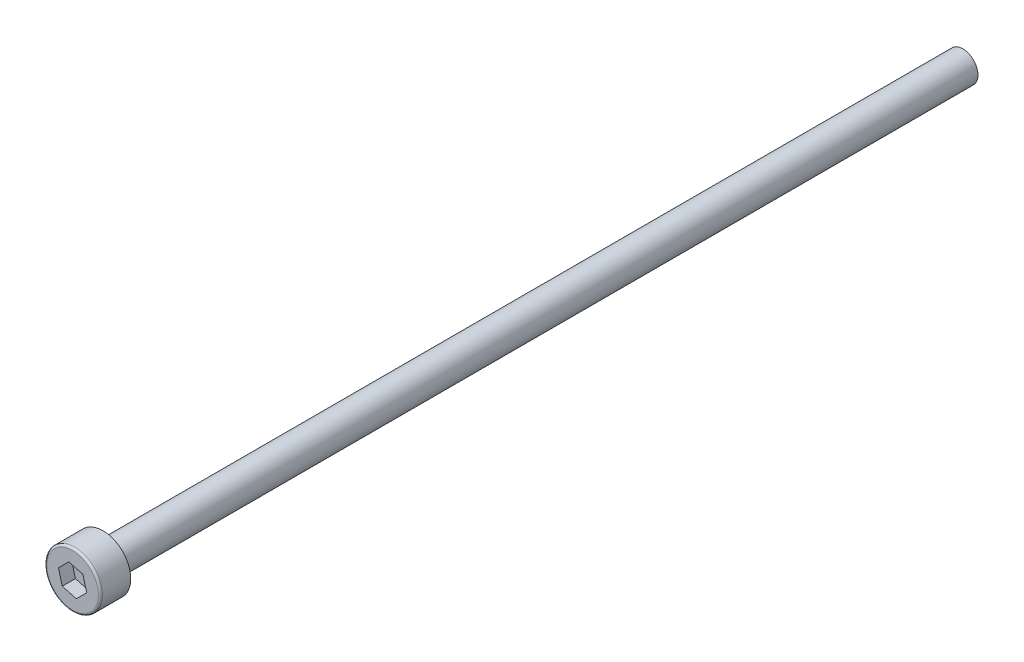
ISO-10303-21;
HEADER;
FILE_DESCRIPTION(('STEP AP214'),'2;1');
FILE_NAME('part.step','',(''),(''),'','','');
FILE_SCHEMA(('AUTOMOTIVE_DESIGN { 1 0 10303 214 1 1 1 1 }'));
ENDSEC;
DATA;
#1=APPLICATION_CONTEXT('core data for automotive mechanical design processes');
#2=APPLICATION_PROTOCOL_DEFINITION('international standard','automotive_design',2000,#1);
#3=PRODUCT_CONTEXT('',#1,'mechanical');
#4=PRODUCT('Part','Part','',(#3));
#5=PRODUCT_RELATED_PRODUCT_CATEGORY('part','',(#4));
#6=PRODUCT_DEFINITION_FORMATION('','',#4);
#7=PRODUCT_DEFINITION_CONTEXT('part definition',#1,'design');
#8=PRODUCT_DEFINITION('design','',#6,#7);
#9=PRODUCT_DEFINITION_SHAPE('','',#8);
#10=(LENGTH_UNIT() NAMED_UNIT(*) SI_UNIT(.MILLI.,.METRE.));
#11=(NAMED_UNIT(*) PLANE_ANGLE_UNIT() SI_UNIT($,.RADIAN.));
#12=(NAMED_UNIT(*) SI_UNIT($,.STERADIAN.) SOLID_ANGLE_UNIT());
#13=UNCERTAINTY_MEASURE_WITH_UNIT(LENGTH_MEASURE(1.E-05),#10,'distance_accuracy_value','');
#14=(GEOMETRIC_REPRESENTATION_CONTEXT(3) GLOBAL_UNCERTAINTY_ASSIGNED_CONTEXT((#13)) GLOBAL_UNIT_ASSIGNED_CONTEXT((#10,
#11,#12)) REPRESENTATION_CONTEXT('',''));
#15=CARTESIAN_POINT('',(0.,0.,0.));
#16=DIRECTION('',(0.,0.,1.));
#17=DIRECTION('',(1.,0.,0.));
#18=AXIS2_PLACEMENT_3D('',#15,#16,#17);
#19=CARTESIAN_POINT('',(0.,0.,0.));
#20=DIRECTION('',(0.,0.,1.));
#21=DIRECTION('',(1.,0.,0.));
#22=AXIS2_PLACEMENT_3D('',#19,#20,#21);
#23=PLANE('',#22);
#24=CARTESIAN_POINT('',(0.,0.,0.));
#25=DIRECTION('',(0.,0.,1.));
#26=DIRECTION('',(1.,0.,0.));
#27=AXIS2_PLACEMENT_3D('',#24,#25,#26);
#28=CIRCLE('',#27,2.75);
#29=CARTESIAN_POINT('',(2.75,0.,0.));
#30=VERTEX_POINT('',#29);
#31=EDGE_CURVE('E136',#30,#30,#28,.T.);
#32=ORIENTED_EDGE('',*,*,#31,.F.);
#33=EDGE_LOOP('',(#32));
#34=FACE_BOUND('',#33,.T.);
#35=CARTESIAN_POINT('',(0.,0.,0.));
#36=DIRECTION('',(0.,0.,1.));
#37=DIRECTION('',(1.,0.,0.));
#38=AXIS2_PLACEMENT_3D('',#35,#36,#37);
#39=CIRCLE('',#38,1.5);
#40=CARTESIAN_POINT('',(1.5,0.,0.));
#41=VERTEX_POINT('',#40);
#42=EDGE_CURVE('E144',#41,#41,#39,.F.);
#43=ORIENTED_EDGE('',*,*,#42,.F.);
#44=EDGE_LOOP('',(#43));
#45=FACE_BOUND('',#44,.T.);
#46=ADVANCED_FACE('F33',(#34,#45),#23,.F.);
#47=CARTESIAN_POINT('',(0.,0.,3.));
#48=DIRECTION('',(0.,0.,-1.));
#49=DIRECTION('',(-1.,0.,0.));
#50=AXIS2_PLACEMENT_3D('',#47,#48,#49);
#51=CYLINDRICAL_SURFACE('',#50,2.75);
#52=CARTESIAN_POINT('',(0.,0.,2.8));
#53=DIRECTION('',(0.,0.,1.));
#54=DIRECTION('',(1.,0.,0.));
#55=AXIS2_PLACEMENT_3D('',#52,#53,#54);
#56=CIRCLE('',#55,2.75);
#57=CARTESIAN_POINT('',(2.75,0.,2.8));
#58=VERTEX_POINT('',#57);
#59=EDGE_CURVE('E11',#58,#58,#56,.F.);
#60=ORIENTED_EDGE('',*,*,#59,.T.);
#61=EDGE_LOOP('',(#60));
#62=FACE_BOUND('',#61,.T.);
#63=ORIENTED_EDGE('',*,*,#31,.T.);
#64=EDGE_LOOP('',(#63));
#65=FACE_BOUND('',#64,.T.);
#66=ADVANCED_FACE('F163',(#62,#65),#51,.T.);
#67=CARTESIAN_POINT('',(0.,0.,3.));
#68=DIRECTION('',(0.,0.,1.));
#69=DIRECTION('',(1.,0.,0.));
#70=AXIS2_PLACEMENT_3D('',#67,#68,#69);
#71=PLANE('',#70);
#72=CARTESIAN_POINT('',(0.,0.,3.));
#73=DIRECTION('',(0.,0.,1.));
#74=DIRECTION('',(1.,0.,0.));
#75=AXIS2_PLACEMENT_3D('',#72,#73,#74);
#76=CIRCLE('',#75,2.55);
#77=CARTESIAN_POINT('',(2.55,0.,3.));
#78=VERTEX_POINT('',#77);
#79=EDGE_CURVE('E41',#78,#78,#76,.T.);
#80=ORIENTED_EDGE('',*,*,#79,.T.);
#81=EDGE_LOOP('',(#80));
#82=FACE_BOUND('',#81,.T.);
#83=DIRECTION('',(0.258819045102521,-0.965925826289068,0.));
#84=VECTOR('',#83,1.);
#85=CARTESIAN_POINT('',(-1.39419383956301,0.373573113403356,3.));
#86=LINE('',#85,#84);
#87=CARTESIAN_POINT('',(-1.39419383956301,0.373573113403356,3.));
#88=VERTEX_POINT('',#87);
#89=CARTESIAN_POINT('',(-1.02062072615966,-1.02062072615966,3.));
#90=VERTEX_POINT('',#89);
#91=EDGE_CURVE('E48',#88,#90,#86,.T.);
#92=ORIENTED_EDGE('',*,*,#91,.F.);
#93=DIRECTION('',(-0.707106781186548,-0.707106781186548,0.));
#94=VECTOR('',#93,1.);
#95=CARTESIAN_POINT('',(-0.373573113403355,1.39419383956301,3.));
#96=LINE('',#95,#94);
#97=CARTESIAN_POINT('',(-0.373573113403355,1.39419383956301,3.));
#98=VERTEX_POINT('',#97);
#99=EDGE_CURVE('E132',#98,#88,#96,.T.);
#100=ORIENTED_EDGE('',*,*,#99,.F.);
#101=DIRECTION('',(-0.965925826289068,0.258819045102521,0.));
#102=VECTOR('',#101,1.);
#103=CARTESIAN_POINT('',(1.02062072615966,1.02062072615966,3.));
#104=LINE('',#103,#102);
#105=CARTESIAN_POINT('',(1.02062072615966,1.02062072615966,3.));
#106=VERTEX_POINT('',#105);
#107=EDGE_CURVE('E130',#106,#98,#104,.T.);
#108=ORIENTED_EDGE('',*,*,#107,.F.);
#109=DIRECTION('',(-0.258819045102521,0.965925826289068,0.));
#110=VECTOR('',#109,1.);
#111=CARTESIAN_POINT('',(1.39419383956301,-0.373573113403355,3.));
#112=LINE('',#111,#110);
#113=CARTESIAN_POINT('',(1.39419383956301,-0.373573113403355,3.));
#114=VERTEX_POINT('',#113);
#115=EDGE_CURVE('E96',#114,#106,#112,.T.);
#116=ORIENTED_EDGE('',*,*,#115,.F.);
#117=DIRECTION('',(0.707106781186548,0.707106781186548,0.));
#118=VECTOR('',#117,1.);
#119=CARTESIAN_POINT('',(0.373573113403355,-1.39419383956301,3.));
#120=LINE('',#119,#118);
#121=CARTESIAN_POINT('',(0.373573113403355,-1.39419383956301,3.));
#122=VERTEX_POINT('',#121);
#123=EDGE_CURVE('E126',#122,#114,#120,.T.);
#124=ORIENTED_EDGE('',*,*,#123,.F.);
#125=DIRECTION('',(0.965925826289068,-0.258819045102521,0.));
#126=VECTOR('',#125,1.);
#127=CARTESIAN_POINT('',(-1.02062072615966,-1.02062072615966,3.));
#128=LINE('',#127,#126);
#129=EDGE_CURVE('E122',#90,#122,#128,.T.);
#130=ORIENTED_EDGE('',*,*,#129,.F.);
#131=EDGE_LOOP('',(#92,#100,#108,#116,#124,#130));
#132=FACE_BOUND('',#131,.T.);
#133=ADVANCED_FACE('F149',(#82,#132),#71,.T.);
#134=CARTESIAN_POINT('',(-1.39419383956301,0.373573113403356,1.7));
#135=DIRECTION('',(-0.965925826289068,-0.258819045102521,0.));
#136=DIRECTION('',(0.258819045102521,-0.965925826289068,0.));
#137=AXIS2_PLACEMENT_3D('',#134,#135,#136);
#138=PLANE('',#137);
#139=ORIENTED_EDGE('',*,*,#91,.T.);
#140=DIRECTION('',(0.,0.,1.));
#141=VECTOR('',#140,1.);
#142=CARTESIAN_POINT('',(-1.02062072615966,-1.02062072615966,1.7));
#143=LINE('',#142,#141);
#144=CARTESIAN_POINT('',(-1.02062072615966,-1.02062072615966,1.7));
#145=VERTEX_POINT('',#144);
#146=EDGE_CURVE('E78',#145,#90,#143,.T.);
#147=ORIENTED_EDGE('',*,*,#146,.F.);
#148=DIRECTION('',(0.258819045102521,-0.965925826289068,0.));
#149=VECTOR('',#148,1.);
#150=CARTESIAN_POINT('',(-1.39419383956301,0.373573113403356,1.7));
#151=LINE('',#150,#149);
#152=CARTESIAN_POINT('',(-1.39419383956301,0.373573113403356,1.7));
#153=VERTEX_POINT('',#152);
#154=EDGE_CURVE('E134',#153,#145,#151,.T.);
#155=ORIENTED_EDGE('',*,*,#154,.F.);
#156=DIRECTION('',(0.,0.,1.));
#157=VECTOR('',#156,1.);
#158=CARTESIAN_POINT('',(-1.39419383956301,0.373573113403356,1.7));
#159=LINE('',#158,#157);
#160=EDGE_CURVE('E56',#153,#88,#159,.T.);
#161=ORIENTED_EDGE('',*,*,#160,.T.);
#162=EDGE_LOOP('',(#139,#147,#155,#161));
#163=FACE_BOUND('',#162,.T.);
#164=ADVANCED_FACE('F175',(#163),#138,.F.);
#165=CARTESIAN_POINT('',(-0.373573113403355,1.39419383956301,1.7));
#166=DIRECTION('',(-0.707106781186548,0.707106781186548,0.));
#167=DIRECTION('',(-0.707106781186548,-0.707106781186548,0.));
#168=AXIS2_PLACEMENT_3D('',#165,#166,#167);
#169=PLANE('',#168);
#170=ORIENTED_EDGE('',*,*,#99,.T.);
#171=ORIENTED_EDGE('',*,*,#160,.F.);
#172=DIRECTION('',(-0.707106781186548,-0.707106781186548,0.));
#173=VECTOR('',#172,1.);
#174=CARTESIAN_POINT('',(-0.373573113403355,1.39419383956301,1.7));
#175=LINE('',#174,#173);
#176=CARTESIAN_POINT('',(-0.373573113403355,1.39419383956301,1.7));
#177=VERTEX_POINT('',#176);
#178=EDGE_CURVE('E108',#177,#153,#175,.T.);
#179=ORIENTED_EDGE('',*,*,#178,.F.);
#180=DIRECTION('',(0.,0.,1.));
#181=VECTOR('',#180,1.);
#182=CARTESIAN_POINT('',(-0.373573113403355,1.39419383956301,1.7));
#183=LINE('',#182,#181);
#184=EDGE_CURVE('E100',#177,#98,#183,.T.);
#185=ORIENTED_EDGE('',*,*,#184,.T.);
#186=EDGE_LOOP('',(#170,#171,#179,#185));
#187=FACE_BOUND('',#186,.T.);
#188=ADVANCED_FACE('F178',(#187),#169,.F.);
#189=CARTESIAN_POINT('',(1.02062072615966,1.02062072615966,1.7));
#190=DIRECTION('',(0.258819045102521,0.965925826289068,0.));
#191=DIRECTION('',(-0.965925826289068,0.258819045102521,0.));
#192=AXIS2_PLACEMENT_3D('',#189,#190,#191);
#193=PLANE('',#192);
#194=ORIENTED_EDGE('',*,*,#107,.T.);
#195=ORIENTED_EDGE('',*,*,#184,.F.);
#196=DIRECTION('',(-0.965925826289068,0.258819045102521,0.));
#197=VECTOR('',#196,1.);
#198=CARTESIAN_POINT('',(1.02062072615966,1.02062072615966,1.7));
#199=LINE('',#198,#197);
#200=CARTESIAN_POINT('',(1.02062072615966,1.02062072615966,1.7));
#201=VERTEX_POINT('',#200);
#202=EDGE_CURVE('E104',#201,#177,#199,.T.);
#203=ORIENTED_EDGE('',*,*,#202,.F.);
#204=DIRECTION('',(0.,0.,1.));
#205=VECTOR('',#204,1.);
#206=CARTESIAN_POINT('',(1.02062072615966,1.02062072615966,1.7));
#207=LINE('',#206,#205);
#208=EDGE_CURVE('E89',#201,#106,#207,.T.);
#209=ORIENTED_EDGE('',*,*,#208,.T.);
#210=EDGE_LOOP('',(#194,#195,#203,#209));
#211=FACE_BOUND('',#210,.T.);
#212=ADVANCED_FACE('F105',(#211),#193,.F.);
#213=CARTESIAN_POINT('',(1.39419383956301,-0.373573113403355,1.7));
#214=DIRECTION('',(0.965925826289068,0.258819045102521,0.));
#215=DIRECTION('',(-0.258819045102521,0.965925826289068,0.));
#216=AXIS2_PLACEMENT_3D('',#213,#214,#215);
#217=PLANE('',#216);
#218=ORIENTED_EDGE('',*,*,#115,.T.);
#219=ORIENTED_EDGE('',*,*,#208,.F.);
#220=DIRECTION('',(-0.258819045102521,0.965925826289068,0.));
#221=VECTOR('',#220,1.);
#222=CARTESIAN_POINT('',(1.39419383956301,-0.373573113403355,1.7));
#223=LINE('',#222,#221);
#224=CARTESIAN_POINT('',(1.39419383956301,-0.373573113403355,1.7));
#225=VERTEX_POINT('',#224);
#226=EDGE_CURVE('E93',#225,#201,#223,.T.);
#227=ORIENTED_EDGE('',*,*,#226,.F.);
#228=DIRECTION('',(0.,0.,1.));
#229=VECTOR('',#228,1.);
#230=CARTESIAN_POINT('',(1.39419383956301,-0.373573113403355,1.7));
#231=LINE('',#230,#229);
#232=EDGE_CURVE('E101',#225,#114,#231,.T.);
#233=ORIENTED_EDGE('',*,*,#232,.T.);
#234=EDGE_LOOP('',(#218,#219,#227,#233));
#235=FACE_BOUND('',#234,.T.);
#236=ADVANCED_FACE('F91',(#235),#217,.F.);
#237=CARTESIAN_POINT('',(0.373573113403355,-1.39419383956301,1.7));
#238=DIRECTION('',(0.707106781186548,-0.707106781186548,0.));
#239=DIRECTION('',(0.707106781186548,0.707106781186548,0.));
#240=AXIS2_PLACEMENT_3D('',#237,#238,#239);
#241=PLANE('',#240);
#242=ORIENTED_EDGE('',*,*,#123,.T.);
#243=ORIENTED_EDGE('',*,*,#232,.F.);
#244=DIRECTION('',(0.707106781186548,0.707106781186548,0.));
#245=VECTOR('',#244,1.);
#246=CARTESIAN_POINT('',(0.373573113403355,-1.39419383956301,1.7));
#247=LINE('',#246,#245);
#248=CARTESIAN_POINT('',(0.373573113403355,-1.39419383956301,1.7));
#249=VERTEX_POINT('',#248);
#250=EDGE_CURVE('E114',#249,#225,#247,.T.);
#251=ORIENTED_EDGE('',*,*,#250,.F.);
#252=DIRECTION('',(0.,0.,1.));
#253=VECTOR('',#252,1.);
#254=CARTESIAN_POINT('',(0.373573113403355,-1.39419383956301,1.7));
#255=LINE('',#254,#253);
#256=EDGE_CURVE('E139',#249,#122,#255,.T.);
#257=ORIENTED_EDGE('',*,*,#256,.T.);
#258=EDGE_LOOP('',(#242,#243,#251,#257));
#259=FACE_BOUND('',#258,.T.);
#260=ADVANCED_FACE('F182',(#259),#241,.F.);
#261=CARTESIAN_POINT('',(-1.02062072615966,-1.02062072615966,1.7));
#262=DIRECTION('',(-0.258819045102521,-0.965925826289068,0.));
#263=DIRECTION('',(0.965925826289068,-0.258819045102521,0.));
#264=AXIS2_PLACEMENT_3D('',#261,#262,#263);
#265=PLANE('',#264);
#266=ORIENTED_EDGE('',*,*,#129,.T.);
#267=ORIENTED_EDGE('',*,*,#256,.F.);
#268=DIRECTION('',(0.965925826289068,-0.258819045102521,0.));
#269=VECTOR('',#268,1.);
#270=CARTESIAN_POINT('',(-1.02062072615966,-1.02062072615966,1.7));
#271=LINE('',#270,#269);
#272=EDGE_CURVE('E116',#145,#249,#271,.T.);
#273=ORIENTED_EDGE('',*,*,#272,.F.);
#274=ORIENTED_EDGE('',*,*,#146,.T.);
#275=EDGE_LOOP('',(#266,#267,#273,#274));
#276=FACE_BOUND('',#275,.T.);
#277=ADVANCED_FACE('F179',(#276),#265,.F.);
#278=CARTESIAN_POINT('',(0.,0.,1.7));
#279=DIRECTION('',(0.,0.,1.));
#280=DIRECTION('',(1.,0.,0.));
#281=AXIS2_PLACEMENT_3D('',#278,#279,#280);
#282=PLANE('',#281);
#283=ORIENTED_EDGE('',*,*,#154,.T.);
#284=ORIENTED_EDGE('',*,*,#272,.T.);
#285=ORIENTED_EDGE('',*,*,#250,.T.);
#286=ORIENTED_EDGE('',*,*,#226,.T.);
#287=ORIENTED_EDGE('',*,*,#202,.T.);
#288=ORIENTED_EDGE('',*,*,#178,.T.);
#289=EDGE_LOOP('',(#283,#284,#285,#286,#287,#288));
#290=FACE_BOUND('',#289,.T.);
#291=ADVANCED_FACE('F111',(#290),#282,.T.);
#292=CARTESIAN_POINT('',(0.,0.,-85.));
#293=DIRECTION('',(0.,0.,1.));
#294=DIRECTION('',(1.,0.,0.));
#295=AXIS2_PLACEMENT_3D('',#292,#293,#294);
#296=CYLINDRICAL_SURFACE('',#295,1.5);
#297=CARTESIAN_POINT('',(0.,0.,-85.));
#298=DIRECTION('',(0.,0.,-1.));
#299=DIRECTION('',(-1.,0.,0.));
#300=AXIS2_PLACEMENT_3D('',#297,#298,#299);
#301=CIRCLE('',#300,1.5);
#302=CARTESIAN_POINT('',(-1.5,0.,-85.));
#303=VERTEX_POINT('',#302);
#304=EDGE_CURVE('E123',#303,#303,#301,.T.);
#305=ORIENTED_EDGE('',*,*,#304,.F.);
#306=EDGE_LOOP('',(#305));
#307=FACE_BOUND('',#306,.T.);
#308=ORIENTED_EDGE('',*,*,#42,.T.);
#309=EDGE_LOOP('',(#308));
#310=FACE_BOUND('',#309,.T.);
#311=ADVANCED_FACE('F158',(#307,#310),#296,.T.);
#312=CARTESIAN_POINT('',(0.,0.,-85.));
#313=DIRECTION('',(0.,0.,-1.));
#314=DIRECTION('',(-1.,0.,0.));
#315=AXIS2_PLACEMENT_3D('',#312,#313,#314);
#316=PLANE('',#315);
#317=ORIENTED_EDGE('',*,*,#304,.T.);
#318=EDGE_LOOP('',(#317));
#319=FACE_BOUND('',#318,.T.);
#320=ADVANCED_FACE('F153',(#319),#316,.T.);
#321=CARTESIAN_POINT('',(0.,0.,2.8));
#322=DIRECTION('',(0.,0.,1.));
#323=DIRECTION('',(1.,0.,0.));
#324=AXIS2_PLACEMENT_3D('',#321,#322,#323);
#325=TOROIDAL_SURFACE('',#324,2.55,0.2);
#326=ORIENTED_EDGE('',*,*,#59,.F.);
#327=EDGE_LOOP('',(#326));
#328=FACE_BOUND('',#327,.T.);
#329=ORIENTED_EDGE('',*,*,#79,.F.);
#330=EDGE_LOOP('',(#329));
#331=FACE_BOUND('',#330,.T.);
#332=ADVANCED_FACE('F35',(#328,#331),#325,.T.);
#333=CLOSED_SHELL('',(#46,#66,#133,#164,#188,#212,#236,#260,#277,#291,#311,#320,#332));
#334=MANIFOLD_SOLID_BREP('B2',#333);
#335=ADVANCED_BREP_SHAPE_REPRESENTATION('',(#18,#334),#14);
#336=SHAPE_DEFINITION_REPRESENTATION(#9,#335);
ENDSEC;
END-ISO-10303-21;
